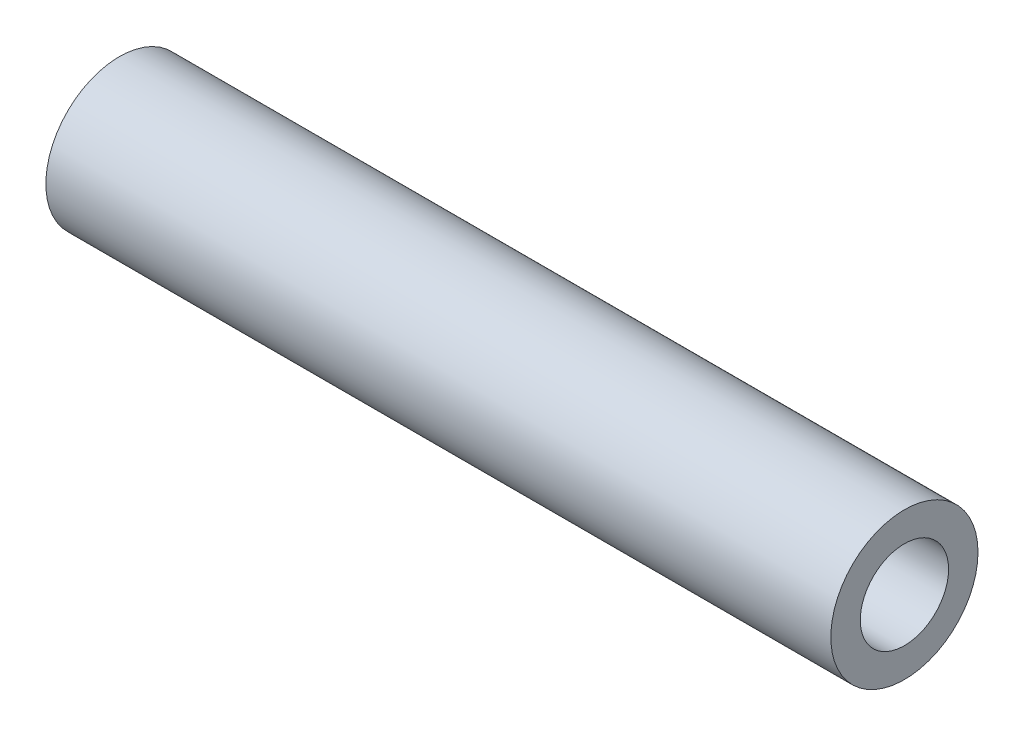
ISO-10303-21;
HEADER;
FILE_DESCRIPTION(('STEP AP214'),'2;1');
FILE_NAME('part.step','',(''),(''),'','','');
FILE_SCHEMA(('AUTOMOTIVE_DESIGN { 1 0 10303 214 1 1 1 1 }'));
ENDSEC;
DATA;
#1=APPLICATION_CONTEXT('core data for automotive mechanical design processes');
#2=APPLICATION_PROTOCOL_DEFINITION('international standard','automotive_design',2000,#1);
#3=PRODUCT_CONTEXT('',#1,'mechanical');
#4=PRODUCT('Part','Part','',(#3));
#5=PRODUCT_RELATED_PRODUCT_CATEGORY('part','',(#4));
#6=PRODUCT_DEFINITION_FORMATION('','',#4);
#7=PRODUCT_DEFINITION_CONTEXT('part definition',#1,'design');
#8=PRODUCT_DEFINITION('design','',#6,#7);
#9=PRODUCT_DEFINITION_SHAPE('','',#8);
#10=(LENGTH_UNIT() NAMED_UNIT(*) SI_UNIT(.MILLI.,.METRE.));
#11=(NAMED_UNIT(*) PLANE_ANGLE_UNIT() SI_UNIT($,.RADIAN.));
#12=(NAMED_UNIT(*) SI_UNIT($,.STERADIAN.) SOLID_ANGLE_UNIT());
#13=UNCERTAINTY_MEASURE_WITH_UNIT(LENGTH_MEASURE(1.E-05),#10,'distance_accuracy_value','');
#14=(GEOMETRIC_REPRESENTATION_CONTEXT(3) GLOBAL_UNCERTAINTY_ASSIGNED_CONTEXT((#13)) GLOBAL_UNIT_ASSIGNED_CONTEXT((#10,
#11,#12)) REPRESENTATION_CONTEXT('',''));
#15=CARTESIAN_POINT('',(0.,0.,0.));
#16=DIRECTION('',(0.,0.,1.));
#17=DIRECTION('',(1.,0.,0.));
#18=AXIS2_PLACEMENT_3D('',#15,#16,#17);
#19=CARTESIAN_POINT('',(40.64,0.,0.));
#20=DIRECTION('',(1.,0.,0.));
#21=DIRECTION('',(0.,0.,-1.));
#22=AXIS2_PLACEMENT_3D('',#19,#20,#21);
#23=PLANE('',#22);
#24=CARTESIAN_POINT('',(40.64,0.,0.));
#25=DIRECTION('',(1.,0.,0.));
#26=DIRECTION('',(0.,0.,-1.));
#27=AXIS2_PLACEMENT_3D('',#24,#25,#26);
#28=CIRCLE('',#27,3.81);
#29=CARTESIAN_POINT('',(40.64,0.,-3.81));
#30=VERTEX_POINT('',#29);
#31=EDGE_CURVE('E10',#30,#30,#28,.T.);
#32=ORIENTED_EDGE('',*,*,#31,.T.);
#33=EDGE_LOOP('',(#32));
#34=FACE_BOUND('',#33,.T.);
#35=CARTESIAN_POINT('',(40.64,0.,0.));
#36=DIRECTION('',(1.,0.,0.));
#37=DIRECTION('',(0.,0.,-1.));
#38=AXIS2_PLACEMENT_3D('',#35,#36,#37);
#39=CIRCLE('',#38,2.286);
#40=CARTESIAN_POINT('',(40.64,0.,-2.286));
#41=VERTEX_POINT('',#40);
#42=EDGE_CURVE('E46',#41,#41,#39,.T.);
#43=ORIENTED_EDGE('',*,*,#42,.F.);
#44=EDGE_LOOP('',(#43));
#45=FACE_BOUND('',#44,.T.);
#46=ADVANCED_FACE('F35',(#34,#45),#23,.T.);
#47=CARTESIAN_POINT('',(0.,0.,0.));
#48=DIRECTION('',(1.,0.,0.));
#49=DIRECTION('',(0.,0.,-1.));
#50=AXIS2_PLACEMENT_3D('',#47,#48,#49);
#51=PLANE('',#50);
#52=CARTESIAN_POINT('',(0.,0.,0.));
#53=DIRECTION('',(1.,0.,0.));
#54=DIRECTION('',(0.,0.,-1.));
#55=AXIS2_PLACEMENT_3D('',#52,#53,#54);
#56=CIRCLE('',#55,3.81);
#57=CARTESIAN_POINT('',(0.,0.,-3.81));
#58=VERTEX_POINT('',#57);
#59=EDGE_CURVE('E39',#58,#58,#56,.T.);
#60=ORIENTED_EDGE('',*,*,#59,.F.);
#61=EDGE_LOOP('',(#60));
#62=FACE_BOUND('',#61,.T.);
#63=CARTESIAN_POINT('',(0.,0.,0.));
#64=DIRECTION('',(1.,0.,0.));
#65=DIRECTION('',(0.,0.,-1.));
#66=AXIS2_PLACEMENT_3D('',#63,#64,#65);
#67=CIRCLE('',#66,2.286);
#68=CARTESIAN_POINT('',(0.,0.,-2.286));
#69=VERTEX_POINT('',#68);
#70=EDGE_CURVE('E48',#69,#69,#67,.T.);
#71=ORIENTED_EDGE('',*,*,#70,.T.);
#72=EDGE_LOOP('',(#71));
#73=FACE_BOUND('',#72,.T.);
#74=ADVANCED_FACE('F58',(#62,#73),#51,.F.);
#75=CARTESIAN_POINT('',(40.64,0.,0.));
#76=DIRECTION('',(-1.,0.,0.));
#77=DIRECTION('',(0.,0.,1.));
#78=AXIS2_PLACEMENT_3D('',#75,#76,#77);
#79=CYLINDRICAL_SURFACE('',#78,3.81);
#80=ORIENTED_EDGE('',*,*,#31,.F.);
#81=EDGE_LOOP('',(#80));
#82=FACE_BOUND('',#81,.T.);
#83=ORIENTED_EDGE('',*,*,#59,.T.);
#84=EDGE_LOOP('',(#83));
#85=FACE_BOUND('',#84,.T.);
#86=ADVANCED_FACE('F37',(#82,#85),#79,.T.);
#87=CARTESIAN_POINT('',(40.64,0.,0.));
#88=DIRECTION('',(-1.,0.,0.));
#89=DIRECTION('',(0.,0.,1.));
#90=AXIS2_PLACEMENT_3D('',#87,#88,#89);
#91=CYLINDRICAL_SURFACE('',#90,2.286);
#92=ORIENTED_EDGE('',*,*,#42,.T.);
#93=EDGE_LOOP('',(#92));
#94=FACE_BOUND('',#93,.T.);
#95=ORIENTED_EDGE('',*,*,#70,.F.);
#96=EDGE_LOOP('',(#95));
#97=FACE_BOUND('',#96,.T.);
#98=ADVANCED_FACE('F54',(#94,#97),#91,.F.);
#99=CLOSED_SHELL('',(#46,#74,#86,#98));
#100=MANIFOLD_SOLID_BREP('B2',#99);
#101=ADVANCED_BREP_SHAPE_REPRESENTATION('',(#18,#100),#14);
#102=SHAPE_DEFINITION_REPRESENTATION(#9,#101);
ENDSEC;
END-ISO-10303-21;
